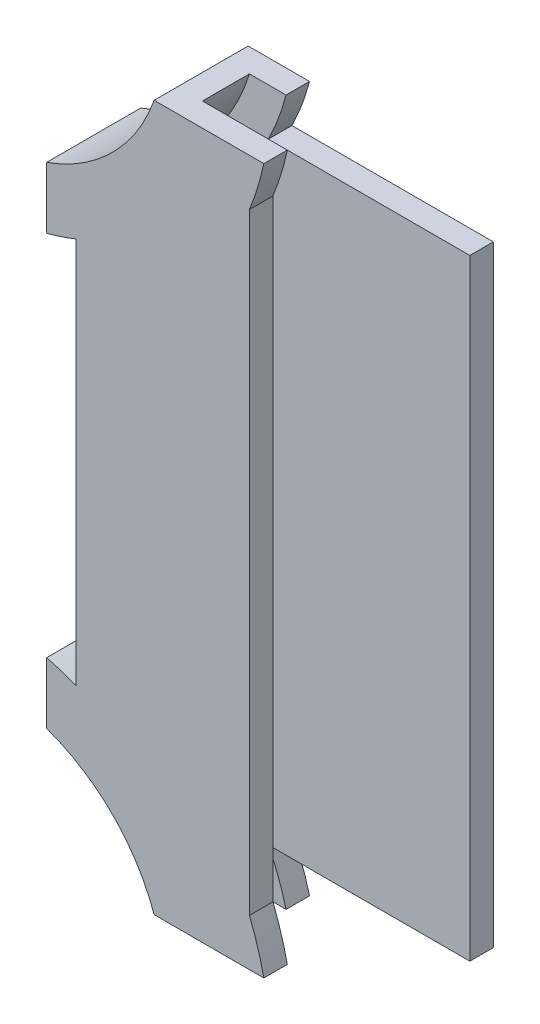
ISO-10303-21;
HEADER;
FILE_DESCRIPTION(('STEP AP214'),'2;1');
FILE_NAME('part.step','',(''),(''),'','','');
FILE_SCHEMA(('AUTOMOTIVE_DESIGN { 1 0 10303 214 1 1 1 1 }'));
ENDSEC;
DATA;
#1=APPLICATION_CONTEXT('core data for automotive mechanical design processes');
#2=APPLICATION_PROTOCOL_DEFINITION('international standard','automotive_design',2000,#1);
#3=PRODUCT_CONTEXT('',#1,'mechanical');
#4=PRODUCT('Part','Part','',(#3));
#5=PRODUCT_RELATED_PRODUCT_CATEGORY('part','',(#4));
#6=PRODUCT_DEFINITION_FORMATION('','',#4);
#7=PRODUCT_DEFINITION_CONTEXT('part definition',#1,'design');
#8=PRODUCT_DEFINITION('design','',#6,#7);
#9=PRODUCT_DEFINITION_SHAPE('','',#8);
#10=(LENGTH_UNIT() NAMED_UNIT(*) SI_UNIT(.MILLI.,.METRE.));
#11=(NAMED_UNIT(*) PLANE_ANGLE_UNIT() SI_UNIT($,.RADIAN.));
#12=(NAMED_UNIT(*) SI_UNIT($,.STERADIAN.) SOLID_ANGLE_UNIT());
#13=UNCERTAINTY_MEASURE_WITH_UNIT(LENGTH_MEASURE(1.E-05),#10,'distance_accuracy_value','');
#14=(GEOMETRIC_REPRESENTATION_CONTEXT(3) GLOBAL_UNCERTAINTY_ASSIGNED_CONTEXT((#13)) GLOBAL_UNIT_ASSIGNED_CONTEXT((#10,
#11,#12)) REPRESENTATION_CONTEXT('',''));
#15=CARTESIAN_POINT('',(0.,0.,0.));
#16=DIRECTION('',(0.,0.,1.));
#17=DIRECTION('',(1.,0.,0.));
#18=AXIS2_PLACEMENT_3D('',#15,#16,#17);
#19=CARTESIAN_POINT('',(-0.327514045387,-0.26,0.06));
#20=DIRECTION('',(-1.,0.,0.));
#21=DIRECTION('',(0.,0.,1.));
#22=AXIS2_PLACEMENT_3D('',#19,#20,#21);
#23=PLANE('',#22);
#24=DIRECTION('',(0.,1.,0.));
#25=VECTOR('',#24,1.);
#26=CARTESIAN_POINT('',(-0.327514045387,0.3,0.08));
#27=LINE('',#26,#25);
#28=CARTESIAN_POINT('',(-0.327514045387056,-0.260000000000183,0.08));
#29=VERTEX_POINT('',#28);
#30=CARTESIAN_POINT('',(-0.327514045387056,0.260000000000183,0.08));
#31=VERTEX_POINT('',#30);
#32=EDGE_CURVE('E188',#29,#31,#27,.T.);
#33=ORIENTED_EDGE('',*,*,#32,.F.);
#34=DIRECTION('',(0.,0.,-1.));
#35=VECTOR('',#34,1.);
#36=CARTESIAN_POINT('',(-0.327514045387112,-0.260000000000045,0.06));
#37=LINE('',#36,#35);
#38=CARTESIAN_POINT('',(-0.327514045387056,-0.260000000000183,0.06));
#39=VERTEX_POINT('',#38);
#40=EDGE_CURVE('E249',#39,#29,#37,.F.);
#41=ORIENTED_EDGE('',*,*,#40,.F.);
#42=DIRECTION('',(0.,1.,0.));
#43=VECTOR('',#42,1.);
#44=CARTESIAN_POINT('',(-0.327514045387,-0.3,0.06));
#45=LINE('',#44,#43);
#46=CARTESIAN_POINT('',(-0.327514045387056,0.260000000000183,0.06));
#47=VERTEX_POINT('',#46);
#48=EDGE_CURVE('E201',#47,#39,#45,.F.);
#49=ORIENTED_EDGE('',*,*,#48,.F.);
#50=DIRECTION('',(0.,0.,-1.));
#51=VECTOR('',#50,1.);
#52=CARTESIAN_POINT('',(-0.327514045387112,0.260000000000045,0.06));
#53=LINE('',#52,#51);
#54=EDGE_CURVE('E200',#31,#47,#53,.T.);
#55=ORIENTED_EDGE('',*,*,#54,.F.);
#56=EDGE_LOOP('',(#33,#41,#49,#55));
#57=FACE_BOUND('',#56,.T.);
#58=ADVANCED_FACE('F17',(#57),#23,.F.);
#59=CARTESIAN_POINT('',(-0.55,0.35,0.06));
#60=DIRECTION('',(0.,0.,-1.));
#61=DIRECTION('',(0.,1.,0.));
#62=AXIS2_PLACEMENT_3D('',#59,#60,#61);
#63=CYLINDRICAL_SURFACE('',#62,0.24);
#64=DIRECTION('',(0.,0.,1.));
#65=VECTOR('',#64,1.);
#66=CARTESIAN_POINT('',(-0.315266108114,0.3,0.));
#67=LINE('',#66,#65);
#68=CARTESIAN_POINT('',(-0.315266108113945,0.3,0.08));
#69=VERTEX_POINT('',#68);
#70=CARTESIAN_POINT('',(-0.315266108113945,0.3,0.06));
#71=VERTEX_POINT('',#70);
#72=EDGE_CURVE('E208',#69,#71,#67,.F.);
#73=ORIENTED_EDGE('',*,*,#72,.F.);
#74=CARTESIAN_POINT('',(-0.55,0.35,0.08));
#75=DIRECTION('',(0.,0.,-1.));
#76=DIRECTION('',(0.,1.,0.));
#77=AXIS2_PLACEMENT_3D('',#74,#75,#76);
#78=CIRCLE('',#77,0.24);
#79=EDGE_CURVE('E20',#31,#69,#78,.F.);
#80=ORIENTED_EDGE('',*,*,#79,.F.);
#81=ORIENTED_EDGE('',*,*,#54,.T.);
#82=CARTESIAN_POINT('',(-0.55,0.35,0.06));
#83=DIRECTION('',(0.,0.,-1.));
#84=DIRECTION('',(0.,1.,0.));
#85=AXIS2_PLACEMENT_3D('',#82,#83,#84);
#86=CIRCLE('',#85,0.24);
#87=EDGE_CURVE('E317',#71,#47,#86,.T.);
#88=ORIENTED_EDGE('',*,*,#87,.F.);
#89=EDGE_LOOP('',(#73,#80,#81,#88));
#90=FACE_BOUND('',#89,.T.);
#91=ADVANCED_FACE('F207',(#90),#63,.T.);
#92=CARTESIAN_POINT('',(-0.55,0.35,0.02));
#93=DIRECTION('',(0.,0.,-1.));
#94=DIRECTION('',(-1.,0.,0.));
#95=AXIS2_PLACEMENT_3D('',#92,#93,#94);
#96=CYLINDRICAL_SURFACE('',#95,0.17);
#97=DIRECTION('',(0.,0.,1.));
#98=VECTOR('',#97,1.);
#99=CARTESIAN_POINT('',(-0.387519231907,0.3,0.));
#100=LINE('',#99,#98);
#101=CARTESIAN_POINT('',(-0.38751923190714,0.3,0.06));
#102=VERTEX_POINT('',#101);
#103=CARTESIAN_POINT('',(-0.38751923190714,0.3,0.02));
#104=VERTEX_POINT('',#103);
#105=EDGE_CURVE('E241',#102,#104,#100,.F.);
#106=ORIENTED_EDGE('',*,*,#105,.F.);
#107=CARTESIAN_POINT('',(-0.55,0.35,0.06));
#108=DIRECTION('',(0.,0.,-1.));
#109=DIRECTION('',(-1.,0.,0.));
#110=AXIS2_PLACEMENT_3D('',#107,#108,#109);
#111=CIRCLE('',#110,0.17);
#112=CARTESIAN_POINT('',(-0.495,0.189142920578773,0.06));
#113=VERTEX_POINT('',#112);
#114=EDGE_CURVE('E319',#113,#102,#111,.F.);
#115=ORIENTED_EDGE('',*,*,#114,.F.);
#116=DIRECTION('',(0.,0.,-1.));
#117=VECTOR('',#116,1.);
#118=CARTESIAN_POINT('',(-0.495,0.189142920579,0.02));
#119=LINE('',#118,#117);
#120=CARTESIAN_POINT('',(-0.495,0.189142920578773,0.02));
#121=VERTEX_POINT('',#120);
#122=EDGE_CURVE('E197',#121,#113,#119,.F.);
#123=ORIENTED_EDGE('',*,*,#122,.F.);
#124=CARTESIAN_POINT('',(-0.55,0.35,0.02));
#125=DIRECTION('',(0.,0.,-1.));
#126=DIRECTION('',(-1.,0.,0.));
#127=AXIS2_PLACEMENT_3D('',#124,#125,#126);
#128=CIRCLE('',#127,0.17);
#129=EDGE_CURVE('E307',#121,#104,#128,.F.);
#130=ORIENTED_EDGE('',*,*,#129,.T.);
#131=EDGE_LOOP('',(#106,#115,#123,#130));
#132=FACE_BOUND('',#131,.T.);
#133=ADVANCED_FACE('F679',(#132),#96,.T.);
#134=CARTESIAN_POINT('',(-0.495,0.3,0.02));
#135=DIRECTION('',(1.,0.,0.));
#136=DIRECTION('',(0.,0.,-1.));
#137=AXIS2_PLACEMENT_3D('',#134,#135,#136);
#138=PLANE('',#137);
#139=DIRECTION('',(0.,1.,0.));
#140=VECTOR('',#139,1.);
#141=CARTESIAN_POINT('',(-0.495,-0.3,0.02));
#142=LINE('',#141,#140);
#143=CARTESIAN_POINT('',(-0.494999999999961,0.157711154769717,0.02));
#144=VERTEX_POINT('',#143);
#145=EDGE_CURVE('E309',#144,#121,#142,.T.);
#146=ORIENTED_EDGE('',*,*,#145,.T.);
#147=ORIENTED_EDGE('',*,*,#122,.T.);
#148=DIRECTION('',(0.,1.,0.));
#149=VECTOR('',#148,1.);
#150=CARTESIAN_POINT('',(-0.495,-0.3,0.06));
#151=LINE('',#150,#149);
#152=CARTESIAN_POINT('',(-0.494999999999961,0.157711154769717,0.06));
#153=VERTEX_POINT('',#152);
#154=EDGE_CURVE('E320',#153,#113,#151,.T.);
#155=ORIENTED_EDGE('',*,*,#154,.F.);
#156=DIRECTION('',(0.,0.,-1.));
#157=VECTOR('',#156,1.);
#158=CARTESIAN_POINT('',(-0.494999999999922,0.157711154769728,0.));
#159=LINE('',#158,#157);
#160=EDGE_CURVE('E224',#144,#153,#159,.F.);
#161=ORIENTED_EDGE('',*,*,#160,.F.);
#162=EDGE_LOOP('',(#146,#147,#155,#161));
#163=FACE_BOUND('',#162,.T.);
#164=ADVANCED_FACE('F671',(#163),#138,.T.);
#165=CARTESIAN_POINT('',(-0.475,-0.164595037823,0.));
#166=DIRECTION('',(-1.,0.,0.));
#167=DIRECTION('',(0.,-1.,0.));
#168=AXIS2_PLACEMENT_3D('',#165,#166,#167);
#169=PLANE('',#168);
#170=DIRECTION('',(0.,1.,0.));
#171=VECTOR('',#170,1.);
#172=CARTESIAN_POINT('',(-0.475,-0.3,0.06));
#173=LINE('',#172,#171);
#174=CARTESIAN_POINT('',(-0.474999999999932,-0.164595037822636,0.06));
#175=VERTEX_POINT('',#174);
#176=CARTESIAN_POINT('',(-0.474999999999932,0.164595037822636,0.06));
#177=VERTEX_POINT('',#176);
#178=EDGE_CURVE('E218',#175,#177,#173,.T.);
#179=ORIENTED_EDGE('',*,*,#178,.F.);
#180=DIRECTION('',(0.,0.,-1.));
#181=VECTOR('',#180,1.);
#182=CARTESIAN_POINT('',(-0.474999999999864,-0.164595037822663,0.));
#183=LINE('',#182,#181);
#184=CARTESIAN_POINT('',(-0.474999999999932,-0.164595037822636,0.08));
#185=VERTEX_POINT('',#184);
#186=EDGE_CURVE('E291',#185,#175,#183,.T.);
#187=ORIENTED_EDGE('',*,*,#186,.F.);
#188=DIRECTION('',(0.,1.,0.));
#189=VECTOR('',#188,1.);
#190=CARTESIAN_POINT('',(-0.475,0.3,0.08));
#191=LINE('',#190,#189);
#192=CARTESIAN_POINT('',(-0.474999999999932,0.164595037822636,0.08));
#193=VERTEX_POINT('',#192);
#194=EDGE_CURVE('E209',#193,#185,#191,.F.);
#195=ORIENTED_EDGE('',*,*,#194,.F.);
#196=DIRECTION('',(0.,0.,-1.));
#197=VECTOR('',#196,1.);
#198=CARTESIAN_POINT('',(-0.474999999999864,0.164595037822663,0.));
#199=LINE('',#198,#197);
#200=EDGE_CURVE('E223',#177,#193,#199,.F.);
#201=ORIENTED_EDGE('',*,*,#200,.F.);
#202=EDGE_LOOP('',(#179,#187,#195,#201));
#203=FACE_BOUND('',#202,.T.);
#204=ADVANCED_FACE('F407',(#203),#169,.T.);
#205=CARTESIAN_POINT('',(-0.495,0.3,0.02));
#206=DIRECTION('',(1.,0.,0.));
#207=DIRECTION('',(0.,0.,-1.));
#208=AXIS2_PLACEMENT_3D('',#205,#206,#207);
#209=PLANE('',#208);
#210=DIRECTION('',(0.,1.,0.));
#211=VECTOR('',#210,1.);
#212=CARTESIAN_POINT('',(-0.495,-0.3,0.02));
#213=LINE('',#212,#211);
#214=CARTESIAN_POINT('',(-0.49499999999993,-0.18914292057857,0.02));
#215=VERTEX_POINT('',#214);
#216=CARTESIAN_POINT('',(-0.494999999999961,-0.157711154769717,0.02));
#217=VERTEX_POINT('',#216);
#218=EDGE_CURVE('E313',#215,#217,#213,.T.);
#219=ORIENTED_EDGE('',*,*,#218,.T.);
#220=DIRECTION('',(0.,0.,-1.));
#221=VECTOR('',#220,1.);
#222=CARTESIAN_POINT('',(-0.494999999999922,-0.157711154769728,0.));
#223=LINE('',#222,#221);
#224=CARTESIAN_POINT('',(-0.494999999999961,-0.157711154769717,0.06));
#225=VERTEX_POINT('',#224);
#226=EDGE_CURVE('E290',#225,#217,#223,.T.);
#227=ORIENTED_EDGE('',*,*,#226,.F.);
#228=DIRECTION('',(0.,1.,0.));
#229=VECTOR('',#228,1.);
#230=CARTESIAN_POINT('',(-0.495,-0.3,0.06));
#231=LINE('',#230,#229);
#232=CARTESIAN_POINT('',(-0.49499999999993,-0.18914292057857,0.06));
#233=VERTEX_POINT('',#232);
#234=EDGE_CURVE('E323',#233,#225,#231,.T.);
#235=ORIENTED_EDGE('',*,*,#234,.F.);
#236=DIRECTION('',(0.,0.,-1.));
#237=VECTOR('',#236,1.);
#238=CARTESIAN_POINT('',(-0.494999999999861,-0.189142920578593,0.02));
#239=LINE('',#238,#237);
#240=EDGE_CURVE('E210',#215,#233,#239,.F.);
#241=ORIENTED_EDGE('',*,*,#240,.F.);
#242=EDGE_LOOP('',(#219,#227,#235,#241));
#243=FACE_BOUND('',#242,.T.);
#244=ADVANCED_FACE('F656',(#243),#209,.T.);
#245=CARTESIAN_POINT('',(-0.5,0.3,0.08));
#246=DIRECTION('',(0.,0.,1.));
#247=DIRECTION('',(1.,0.,0.));
#248=AXIS2_PLACEMENT_3D('',#245,#246,#247);
#249=PLANE('',#248);
#250=DIRECTION('',(1.,0.,0.));
#251=VECTOR('',#250,1.);
#252=CARTESIAN_POINT('',(-0.2,-0.3,0.08));
#253=LINE('',#252,#251);
#254=CARTESIAN_POINT('',(-0.315266108113945,-0.3,0.08));
#255=VERTEX_POINT('',#254);
#256=CARTESIAN_POINT('',(-0.408578643762845,-0.3,0.08));
#257=VERTEX_POINT('',#256);
#258=EDGE_CURVE('E285',#255,#257,#253,.F.);
#259=ORIENTED_EDGE('',*,*,#258,.F.);
#260=CARTESIAN_POINT('',(-0.55,-0.35,0.08));
#261=DIRECTION('',(0.,0.,-1.));
#262=DIRECTION('',(0.,1.,0.));
#263=AXIS2_PLACEMENT_3D('',#260,#261,#262);
#264=CIRCLE('',#263,0.24);
#265=EDGE_CURVE('E194',#29,#255,#264,.T.);
#266=ORIENTED_EDGE('',*,*,#265,.F.);
#267=ORIENTED_EDGE('',*,*,#32,.T.);
#268=ORIENTED_EDGE('',*,*,#79,.T.);
#269=DIRECTION('',(1.,0.,0.));
#270=VECTOR('',#269,1.);
#271=CARTESIAN_POINT('',(-0.5,0.3,0.08));
#272=LINE('',#271,#270);
#273=CARTESIAN_POINT('',(-0.408578643762708,0.299999999999951,0.08));
#274=VERTEX_POINT('',#273);
#275=EDGE_CURVE('E234',#274,#69,#272,.T.);
#276=ORIENTED_EDGE('',*,*,#275,.F.);
#277=CARTESIAN_POINT('',(-0.55,0.35,0.08));
#278=DIRECTION('',(0.,0.,-1.));
#279=DIRECTION('',(-1.,0.,0.));
#280=AXIS2_PLACEMENT_3D('',#277,#278,#279);
#281=CIRCLE('',#280,0.15);
#282=CARTESIAN_POINT('',(-0.5,0.208578643762845,0.08));
#283=VERTEX_POINT('',#282);
#284=EDGE_CURVE('E233',#274,#283,#281,.T.);
#285=ORIENTED_EDGE('',*,*,#284,.T.);
#286=DIRECTION('',(0.,1.,0.));
#287=VECTOR('',#286,1.);
#288=CARTESIAN_POINT('',(-0.5,-0.3,0.08));
#289=LINE('',#288,#287);
#290=CARTESIAN_POINT('',(-0.499999999999955,0.156350832689641,0.08));
#291=VERTEX_POINT('',#290);
#292=EDGE_CURVE('E230',#291,#283,#289,.T.);
#293=ORIENTED_EDGE('',*,*,#292,.F.);
#294=CARTESIAN_POINT('',(-0.55,0.35,0.08));
#295=DIRECTION('',(0.,0.,-1.));
#296=DIRECTION('',(0.,1.,0.));
#297=AXIS2_PLACEMENT_3D('',#294,#295,#296);
#298=CIRCLE('',#297,0.2);
#299=EDGE_CURVE('E302',#193,#291,#298,.T.);
#300=ORIENTED_EDGE('',*,*,#299,.F.);
#301=ORIENTED_EDGE('',*,*,#194,.T.);
#302=CARTESIAN_POINT('',(-0.55,-0.35,0.08));
#303=DIRECTION('',(0.,0.,-1.));
#304=DIRECTION('',(0.,1.,0.));
#305=AXIS2_PLACEMENT_3D('',#302,#303,#304);
#306=CIRCLE('',#305,0.2);
#307=CARTESIAN_POINT('',(-0.5,-0.156350832689815,0.08));
#308=VERTEX_POINT('',#307);
#309=EDGE_CURVE('E292',#308,#185,#306,.T.);
#310=ORIENTED_EDGE('',*,*,#309,.F.);
#311=DIRECTION('',(0.,1.,0.));
#312=VECTOR('',#311,1.);
#313=CARTESIAN_POINT('',(-0.5,-0.3,0.08));
#314=LINE('',#313,#312);
#315=CARTESIAN_POINT('',(-0.499999999999951,-0.208578643762708,0.08));
#316=VERTEX_POINT('',#315);
#317=EDGE_CURVE('E343',#316,#308,#314,.T.);
#318=ORIENTED_EDGE('',*,*,#317,.F.);
#319=CARTESIAN_POINT('',(-0.55,-0.35,0.08));
#320=DIRECTION('',(0.,0.,-1.));
#321=DIRECTION('',(-1.,0.,0.));
#322=AXIS2_PLACEMENT_3D('',#319,#320,#321);
#323=CIRCLE('',#322,0.15);
#324=EDGE_CURVE('E282',#316,#257,#323,.T.);
#325=ORIENTED_EDGE('',*,*,#324,.T.);
#326=EDGE_LOOP('',(#259,#266,#267,#268,#276,#285,#293,#300,#301,#310,#318,#325));
#327=FACE_BOUND('',#326,.T.);
#328=ADVANCED_FACE('F191',(#327),#249,.T.);
#329=CARTESIAN_POINT('',(-0.55,-0.35,0.02));
#330=DIRECTION('',(0.,0.,-1.));
#331=DIRECTION('',(-1.,0.,0.));
#332=AXIS2_PLACEMENT_3D('',#329,#330,#331);
#333=CYLINDRICAL_SURFACE('',#332,0.17);
#334=ORIENTED_EDGE('',*,*,#240,.T.);
#335=CARTESIAN_POINT('',(-0.55,-0.35,0.06));
#336=DIRECTION('',(0.,0.,-1.));
#337=DIRECTION('',(-1.,0.,0.));
#338=AXIS2_PLACEMENT_3D('',#335,#336,#337);
#339=CIRCLE('',#338,0.17);
#340=CARTESIAN_POINT('',(-0.38751923190714,-0.3,0.06));
#341=VERTEX_POINT('',#340);
#342=EDGE_CURVE('E321',#341,#233,#339,.F.);
#343=ORIENTED_EDGE('',*,*,#342,.F.);
#344=DIRECTION('',(0.,0.,-1.));
#345=VECTOR('',#344,1.);
#346=CARTESIAN_POINT('',(-0.387519231907,-0.3,0.));
#347=LINE('',#346,#345);
#348=CARTESIAN_POINT('',(-0.38751923190714,-0.3,0.02));
#349=VERTEX_POINT('',#348);
#350=EDGE_CURVE('E333',#349,#341,#347,.F.);
#351=ORIENTED_EDGE('',*,*,#350,.F.);
#352=CARTESIAN_POINT('',(-0.55,-0.35,0.02));
#353=DIRECTION('',(0.,0.,-1.));
#354=DIRECTION('',(-1.,0.,0.));
#355=AXIS2_PLACEMENT_3D('',#352,#353,#354);
#356=CIRCLE('',#355,0.17);
#357=EDGE_CURVE('E310',#349,#215,#356,.F.);
#358=ORIENTED_EDGE('',*,*,#357,.T.);
#359=EDGE_LOOP('',(#334,#343,#351,#358));
#360=FACE_BOUND('',#359,.T.);
#361=ADVANCED_FACE('F488',(#360),#333,.T.);
#362=CARTESIAN_POINT('',(-0.495,-0.3,0.06));
#363=DIRECTION('',(0.,0.,-1.));
#364=DIRECTION('',(0.,1.,0.));
#365=AXIS2_PLACEMENT_3D('',#362,#363,#364);
#366=PLANE('',#365);
#367=DIRECTION('',(1.,0.,0.));
#368=VECTOR('',#367,1.);
#369=CARTESIAN_POINT('',(-0.5,0.3,0.06));
#370=LINE('',#369,#368);
#371=EDGE_CURVE('E238',#71,#102,#370,.F.);
#372=ORIENTED_EDGE('',*,*,#371,.F.);
#373=ORIENTED_EDGE('',*,*,#87,.T.);
#374=ORIENTED_EDGE('',*,*,#48,.T.);
#375=CARTESIAN_POINT('',(-0.55,-0.35,0.06));
#376=DIRECTION('',(0.,0.,-1.));
#377=DIRECTION('',(0.,1.,0.));
#378=AXIS2_PLACEMENT_3D('',#375,#376,#377);
#379=CIRCLE('',#378,0.24);
#380=CARTESIAN_POINT('',(-0.315266108113945,-0.3,0.06));
#381=VERTEX_POINT('',#380);
#382=EDGE_CURVE('E250',#381,#39,#379,.F.);
#383=ORIENTED_EDGE('',*,*,#382,.F.);
#384=DIRECTION('',(1.,0.,0.));
#385=VECTOR('',#384,1.);
#386=CARTESIAN_POINT('',(-0.2,-0.3,0.06));
#387=LINE('',#386,#385);
#388=EDGE_CURVE('E335',#341,#381,#387,.T.);
#389=ORIENTED_EDGE('',*,*,#388,.F.);
#390=ORIENTED_EDGE('',*,*,#342,.T.);
#391=ORIENTED_EDGE('',*,*,#234,.T.);
#392=CARTESIAN_POINT('',(-0.55,-0.35,0.06));
#393=DIRECTION('',(0.,0.,-1.));
#394=DIRECTION('',(0.,1.,0.));
#395=AXIS2_PLACEMENT_3D('',#392,#393,#394);
#396=CIRCLE('',#395,0.2);
#397=EDGE_CURVE('E287',#175,#225,#396,.F.);
#398=ORIENTED_EDGE('',*,*,#397,.F.);
#399=ORIENTED_EDGE('',*,*,#178,.T.);
#400=CARTESIAN_POINT('',(-0.55,0.35,0.06));
#401=DIRECTION('',(0.,0.,-1.));
#402=DIRECTION('',(0.,1.,0.));
#403=AXIS2_PLACEMENT_3D('',#400,#401,#402);
#404=CIRCLE('',#403,0.2);
#405=EDGE_CURVE('E226',#153,#177,#404,.F.);
#406=ORIENTED_EDGE('',*,*,#405,.F.);
#407=ORIENTED_EDGE('',*,*,#154,.T.);
#408=ORIENTED_EDGE('',*,*,#114,.T.);
#409=EDGE_LOOP('',(#372,#373,#374,#383,#389,#390,#391,#398,#399,#406,#407,#408));
#410=FACE_BOUND('',#409,.T.);
#411=ADVANCED_FACE('F400',(#410),#366,.T.);
#412=CARTESIAN_POINT('',(-0.55,-0.35,0.06));
#413=DIRECTION('',(0.,0.,-1.));
#414=DIRECTION('',(0.,1.,0.));
#415=AXIS2_PLACEMENT_3D('',#412,#413,#414);
#416=CYLINDRICAL_SURFACE('',#415,0.24);
#417=ORIENTED_EDGE('',*,*,#40,.T.);
#418=ORIENTED_EDGE('',*,*,#265,.T.);
#419=DIRECTION('',(0.,0.,-1.));
#420=VECTOR('',#419,1.);
#421=CARTESIAN_POINT('',(-0.315266108114,-0.3,0.));
#422=LINE('',#421,#420);
#423=EDGE_CURVE('E338',#381,#255,#422,.F.);
#424=ORIENTED_EDGE('',*,*,#423,.F.);
#425=ORIENTED_EDGE('',*,*,#382,.T.);
#426=EDGE_LOOP('',(#417,#418,#424,#425));
#427=FACE_BOUND('',#426,.T.);
#428=ADVANCED_FACE('F491',(#427),#416,.T.);
#429=CARTESIAN_POINT('',(-0.495,-0.3,0.02));
#430=DIRECTION('',(0.,0.,-1.));
#431=DIRECTION('',(0.,1.,0.));
#432=AXIS2_PLACEMENT_3D('',#429,#430,#431);
#433=PLANE('',#432);
#434=DIRECTION('',(0.,1.,0.));
#435=VECTOR('',#434,1.);
#436=CARTESIAN_POINT('',(-0.2,0.3,0.02));
#437=LINE('',#436,#435);
#438=CARTESIAN_POINT('',(-0.2,0.26,0.02));
#439=VERTEX_POINT('',#438);
#440=CARTESIAN_POINT('',(-0.2,-0.26,0.02));
#441=VERTEX_POINT('',#440);
#442=EDGE_CURVE('E383',#439,#441,#437,.F.);
#443=ORIENTED_EDGE('',*,*,#442,.F.);
#444=DIRECTION('',(1.,0.,0.));
#445=VECTOR('',#444,1.);
#446=CARTESIAN_POINT('',(-0.371394289005,0.26,0.02));
#447=LINE('',#446,#445);
#448=CARTESIAN_POINT('',(-0.371394289005041,0.26,0.02));
#449=VERTEX_POINT('',#448);
#450=EDGE_CURVE('E276',#449,#439,#447,.T.);
#451=ORIENTED_EDGE('',*,*,#450,.F.);
#452=CARTESIAN_POINT('',(-0.55,0.35,0.02));
#453=DIRECTION('',(0.,0.,-1.));
#454=DIRECTION('',(0.,1.,0.));
#455=AXIS2_PLACEMENT_3D('',#452,#453,#454);
#456=CIRCLE('',#455,0.2);
#457=CARTESIAN_POINT('',(-0.356350832689815,0.3,0.02));
#458=VERTEX_POINT('',#457);
#459=EDGE_CURVE('E247',#458,#449,#456,.T.);
#460=ORIENTED_EDGE('',*,*,#459,.F.);
#461=DIRECTION('',(1.,0.,0.));
#462=VECTOR('',#461,1.);
#463=CARTESIAN_POINT('',(-0.5,0.3,0.02));
#464=LINE('',#463,#462);
#465=EDGE_CURVE('E245',#104,#458,#464,.T.);
#466=ORIENTED_EDGE('',*,*,#465,.F.);
#467=ORIENTED_EDGE('',*,*,#129,.F.);
#468=ORIENTED_EDGE('',*,*,#145,.F.);
#469=CARTESIAN_POINT('',(-0.55,0.35,0.02));
#470=DIRECTION('',(0.,0.,-1.));
#471=DIRECTION('',(0.,1.,0.));
#472=AXIS2_PLACEMENT_3D('',#469,#470,#471);
#473=CIRCLE('',#472,0.2);
#474=CARTESIAN_POINT('',(-0.475000000000003,0.164595037822804,0.02));
#475=VERTEX_POINT('',#474);
#476=EDGE_CURVE('E227',#475,#144,#473,.T.);
#477=ORIENTED_EDGE('',*,*,#476,.F.);
#478=DIRECTION('',(0.,-1.,0.));
#479=VECTOR('',#478,1.);
#480=CARTESIAN_POINT('',(-0.475,-0.164595037823,0.02));
#481=LINE('',#480,#479);
#482=CARTESIAN_POINT('',(-0.474999999999932,-0.164595037822636,0.02));
#483=VERTEX_POINT('',#482);
#484=EDGE_CURVE('E220',#483,#475,#481,.F.);
#485=ORIENTED_EDGE('',*,*,#484,.F.);
#486=CARTESIAN_POINT('',(-0.55,-0.35,0.02));
#487=DIRECTION('',(0.,0.,-1.));
#488=DIRECTION('',(0.,1.,0.));
#489=AXIS2_PLACEMENT_3D('',#486,#487,#488);
#490=CIRCLE('',#489,0.2);
#491=EDGE_CURVE('E295',#217,#483,#490,.T.);
#492=ORIENTED_EDGE('',*,*,#491,.F.);
#493=ORIENTED_EDGE('',*,*,#218,.F.);
#494=ORIENTED_EDGE('',*,*,#357,.F.);
#495=DIRECTION('',(1.,0.,0.));
#496=VECTOR('',#495,1.);
#497=CARTESIAN_POINT('',(-0.2,-0.3,0.02));
#498=LINE('',#497,#496);
#499=CARTESIAN_POINT('',(-0.356350832689641,-0.299999999999955,0.02));
#500=VERTEX_POINT('',#499);
#501=EDGE_CURVE('E336',#500,#349,#498,.F.);
#502=ORIENTED_EDGE('',*,*,#501,.F.);
#503=CARTESIAN_POINT('',(-0.55,-0.35,0.02));
#504=DIRECTION('',(0.,0.,-1.));
#505=DIRECTION('',(0.,1.,0.));
#506=AXIS2_PLACEMENT_3D('',#503,#504,#505);
#507=CIRCLE('',#506,0.2);
#508=CARTESIAN_POINT('',(-0.371394289005041,-0.26,0.02));
#509=VERTEX_POINT('',#508);
#510=EDGE_CURVE('E277',#509,#500,#507,.T.);
#511=ORIENTED_EDGE('',*,*,#510,.F.);
#512=DIRECTION('',(1.,0.,0.));
#513=VECTOR('',#512,1.);
#514=CARTESIAN_POINT('',(-0.2,-0.26,0.02));
#515=LINE('',#514,#513);
#516=EDGE_CURVE('E386',#441,#509,#515,.F.);
#517=ORIENTED_EDGE('',*,*,#516,.F.);
#518=EDGE_LOOP('',(#443,#451,#460,#466,#467,#468,#477,#485,#492,#493,#494,#502,#511,#517));
#519=FACE_BOUND('',#518,.T.);
#520=ADVANCED_FACE('F356',(#519),#433,.F.);
#521=CARTESIAN_POINT('',(-0.55,0.35,0.));
#522=DIRECTION('',(0.,0.,-1.));
#523=DIRECTION('',(0.,1.,0.));
#524=AXIS2_PLACEMENT_3D('',#521,#522,#523);
#525=CYLINDRICAL_SURFACE('',#524,0.2);
#526=DIRECTION('',(0.,0.,1.));
#527=VECTOR('',#526,1.);
#528=CARTESIAN_POINT('',(-0.35635083269,0.3,0.));
#529=LINE('',#528,#527);
#530=CARTESIAN_POINT('',(-0.356350832689815,0.3,0.));
#531=VERTEX_POINT('',#530);
#532=EDGE_CURVE('E236',#458,#531,#529,.F.);
#533=ORIENTED_EDGE('',*,*,#532,.F.);
#534=ORIENTED_EDGE('',*,*,#459,.T.);
#535=DIRECTION('',(0.,0.,1.));
#536=VECTOR('',#535,1.);
#537=CARTESIAN_POINT('',(-0.371394289005,0.26,0.));
#538=LINE('',#537,#536);
#539=CARTESIAN_POINT('',(-0.371394289005041,0.26,0.));
#540=VERTEX_POINT('',#539);
#541=EDGE_CURVE('E380',#540,#449,#538,.T.);
#542=ORIENTED_EDGE('',*,*,#541,.F.);
#543=CARTESIAN_POINT('',(-0.55,0.35,0.));
#544=DIRECTION('',(0.,0.,-1.));
#545=DIRECTION('',(0.,1.,0.));
#546=AXIS2_PLACEMENT_3D('',#543,#544,#545);
#547=CIRCLE('',#546,0.2);
#548=EDGE_CURVE('E273',#540,#531,#547,.F.);
#549=ORIENTED_EDGE('',*,*,#548,.T.);
#550=EDGE_LOOP('',(#533,#534,#542,#549));
#551=FACE_BOUND('',#550,.T.);
#552=ADVANCED_FACE('F480',(#551),#525,.T.);
#553=CARTESIAN_POINT('',(-0.5,0.3,0.));
#554=DIRECTION('',(0.,1.,0.));
#555=DIRECTION('',(0.,0.,1.));
#556=AXIS2_PLACEMENT_3D('',#553,#554,#555);
#557=PLANE('',#556);
#558=ORIENTED_EDGE('',*,*,#371,.T.);
#559=ORIENTED_EDGE('',*,*,#105,.T.);
#560=ORIENTED_EDGE('',*,*,#465,.T.);
#561=ORIENTED_EDGE('',*,*,#532,.T.);
#562=DIRECTION('',(1.,0.,0.));
#563=VECTOR('',#562,1.);
#564=CARTESIAN_POINT('',(-0.5,0.3,0.));
#565=LINE('',#564,#563);
#566=CARTESIAN_POINT('',(-0.408578643762708,0.299999999999951,0.));
#567=VERTEX_POINT('',#566);
#568=EDGE_CURVE('E272',#531,#567,#565,.F.);
#569=ORIENTED_EDGE('',*,*,#568,.T.);
#570=DIRECTION('',(0.,0.,-1.));
#571=VECTOR('',#570,1.);
#572=CARTESIAN_POINT('',(-0.408578643762725,0.299999999999903,0.));
#573=LINE('',#572,#571);
#574=EDGE_CURVE('E244',#567,#274,#573,.F.);
#575=ORIENTED_EDGE('',*,*,#574,.T.);
#576=ORIENTED_EDGE('',*,*,#275,.T.);
#577=ORIENTED_EDGE('',*,*,#72,.T.);
#578=EDGE_LOOP('',(#558,#559,#560,#561,#569,#575,#576,#577));
#579=FACE_BOUND('',#578,.T.);
#580=ADVANCED_FACE('F476',(#579),#557,.T.);
#581=CARTESIAN_POINT('',(-0.55,0.35,0.));
#582=DIRECTION('',(0.,0.,-1.));
#583=DIRECTION('',(-1.,0.,0.));
#584=AXIS2_PLACEMENT_3D('',#581,#582,#583);
#585=CYLINDRICAL_SURFACE('',#584,0.15);
#586=ORIENTED_EDGE('',*,*,#284,.F.);
#587=ORIENTED_EDGE('',*,*,#574,.F.);
#588=CARTESIAN_POINT('',(-0.55,0.35,0.));
#589=DIRECTION('',(0.,0.,-1.));
#590=DIRECTION('',(-1.,0.,0.));
#591=AXIS2_PLACEMENT_3D('',#588,#589,#590);
#592=CIRCLE('',#591,0.15);
#593=CARTESIAN_POINT('',(-0.5,0.208578643762845,0.));
#594=VERTEX_POINT('',#593);
#595=EDGE_CURVE('E269',#567,#594,#592,.T.);
#596=ORIENTED_EDGE('',*,*,#595,.T.);
#597=DIRECTION('',(0.,0.,1.));
#598=VECTOR('',#597,1.);
#599=CARTESIAN_POINT('',(-0.5,0.208578643763,0.));
#600=LINE('',#599,#598);
#601=EDGE_CURVE('E232',#283,#594,#600,.F.);
#602=ORIENTED_EDGE('',*,*,#601,.F.);
#603=EDGE_LOOP('',(#586,#587,#596,#602));
#604=FACE_BOUND('',#603,.T.);
#605=ADVANCED_FACE('F474',(#604),#585,.F.);
#606=CARTESIAN_POINT('',(-0.5,-0.3,0.));
#607=DIRECTION('',(-1.,0.,0.));
#608=DIRECTION('',(0.,0.,1.));
#609=AXIS2_PLACEMENT_3D('',#606,#607,#608);
#610=PLANE('',#609);
#611=DIRECTION('',(0.,1.,0.));
#612=VECTOR('',#611,1.);
#613=CARTESIAN_POINT('',(-0.5,0.3,0.));
#614=LINE('',#613,#612);
#615=CARTESIAN_POINT('',(-0.499999999999955,0.156350832689641,0.));
#616=VERTEX_POINT('',#615);
#617=EDGE_CURVE('E268',#594,#616,#614,.F.);
#618=ORIENTED_EDGE('',*,*,#617,.T.);
#619=DIRECTION('',(0.,0.,-1.));
#620=VECTOR('',#619,1.);
#621=CARTESIAN_POINT('',(-0.49999999999991,0.156350832689652,0.));
#622=LINE('',#621,#620);
#623=EDGE_CURVE('E301',#291,#616,#622,.T.);
#624=ORIENTED_EDGE('',*,*,#623,.F.);
#625=ORIENTED_EDGE('',*,*,#292,.T.);
#626=ORIENTED_EDGE('',*,*,#601,.T.);
#627=EDGE_LOOP('',(#618,#624,#625,#626));
#628=FACE_BOUND('',#627,.T.);
#629=ADVANCED_FACE('F468',(#628),#610,.T.);
#630=CARTESIAN_POINT('',(-0.55,0.35,0.));
#631=DIRECTION('',(0.,0.,-1.));
#632=DIRECTION('',(0.,1.,0.));
#633=AXIS2_PLACEMENT_3D('',#630,#631,#632);
#634=CYLINDRICAL_SURFACE('',#633,0.2);
#635=ORIENTED_EDGE('',*,*,#405,.T.);
#636=ORIENTED_EDGE('',*,*,#200,.T.);
#637=ORIENTED_EDGE('',*,*,#299,.T.);
#638=ORIENTED_EDGE('',*,*,#623,.T.);
#639=CARTESIAN_POINT('',(-0.55,0.35,0.));
#640=DIRECTION('',(0.,0.,-1.));
#641=DIRECTION('',(0.,1.,0.));
#642=AXIS2_PLACEMENT_3D('',#639,#640,#641);
#643=CIRCLE('',#642,0.2);
#644=CARTESIAN_POINT('',(-0.475000000000002,0.164595037822804,0.));
#645=VERTEX_POINT('',#644);
#646=EDGE_CURVE('E265',#616,#645,#643,.F.);
#647=ORIENTED_EDGE('',*,*,#646,.T.);
#648=DIRECTION('',(0.,0.,1.));
#649=VECTOR('',#648,1.);
#650=CARTESIAN_POINT('',(-0.475000000000003,0.164595037823,0.));
#651=LINE('',#650,#649);
#652=EDGE_CURVE('E222',#475,#645,#651,.F.);
#653=ORIENTED_EDGE('',*,*,#652,.F.);
#654=ORIENTED_EDGE('',*,*,#476,.T.);
#655=ORIENTED_EDGE('',*,*,#160,.T.);
#656=EDGE_LOOP('',(#635,#636,#637,#638,#647,#653,#654,#655));
#657=FACE_BOUND('',#656,.T.);
#658=ADVANCED_FACE('F405',(#657),#634,.T.);
#659=CARTESIAN_POINT('',(-0.475,-0.164595037823,0.));
#660=DIRECTION('',(-1.,0.,0.));
#661=DIRECTION('',(0.,-1.,0.));
#662=AXIS2_PLACEMENT_3D('',#659,#660,#661);
#663=PLANE('',#662);
#664=DIRECTION('',(0.,1.,0.));
#665=VECTOR('',#664,1.);
#666=CARTESIAN_POINT('',(-0.475,0.3,0.));
#667=LINE('',#666,#665);
#668=CARTESIAN_POINT('',(-0.474999999999932,-0.164595037822636,0.));
#669=VERTEX_POINT('',#668);
#670=EDGE_CURVE('E264',#645,#669,#667,.F.);
#671=ORIENTED_EDGE('',*,*,#670,.T.);
#672=DIRECTION('',(0.,0.,-1.));
#673=VECTOR('',#672,1.);
#674=CARTESIAN_POINT('',(-0.474999999999864,-0.164595037822663,0.));
#675=LINE('',#674,#673);
#676=EDGE_CURVE('E294',#483,#669,#675,.T.);
#677=ORIENTED_EDGE('',*,*,#676,.F.);
#678=ORIENTED_EDGE('',*,*,#484,.T.);
#679=ORIENTED_EDGE('',*,*,#652,.T.);
#680=EDGE_LOOP('',(#671,#677,#678,#679));
#681=FACE_BOUND('',#680,.T.);
#682=ADVANCED_FACE('F362',(#681),#663,.T.);
#683=CARTESIAN_POINT('',(-0.55,-0.35,0.));
#684=DIRECTION('',(0.,0.,-1.));
#685=DIRECTION('',(0.,1.,0.));
#686=AXIS2_PLACEMENT_3D('',#683,#684,#685);
#687=CYLINDRICAL_SURFACE('',#686,0.2);
#688=ORIENTED_EDGE('',*,*,#397,.T.);
#689=ORIENTED_EDGE('',*,*,#226,.T.);
#690=ORIENTED_EDGE('',*,*,#491,.T.);
#691=ORIENTED_EDGE('',*,*,#676,.T.);
#692=CARTESIAN_POINT('',(-0.55,-0.35,0.));
#693=DIRECTION('',(0.,0.,-1.));
#694=DIRECTION('',(0.,1.,0.));
#695=AXIS2_PLACEMENT_3D('',#692,#693,#694);
#696=CIRCLE('',#695,0.2);
#697=CARTESIAN_POINT('',(-0.5,-0.156350832689815,0.));
#698=VERTEX_POINT('',#697);
#699=EDGE_CURVE('E261',#669,#698,#696,.F.);
#700=ORIENTED_EDGE('',*,*,#699,.T.);
#701=DIRECTION('',(0.,0.,1.));
#702=VECTOR('',#701,1.);
#703=CARTESIAN_POINT('',(-0.5,-0.15635083269,0.));
#704=LINE('',#703,#702);
#705=EDGE_CURVE('E345',#308,#698,#704,.F.);
#706=ORIENTED_EDGE('',*,*,#705,.F.);
#707=ORIENTED_EDGE('',*,*,#309,.T.);
#708=ORIENTED_EDGE('',*,*,#186,.T.);
#709=EDGE_LOOP('',(#688,#689,#690,#691,#700,#706,#707,#708));
#710=FACE_BOUND('',#709,.T.);
#711=ADVANCED_FACE('F350',(#710),#687,.T.);
#712=CARTESIAN_POINT('',(-0.5,-0.3,0.));
#713=DIRECTION('',(-1.,0.,0.));
#714=DIRECTION('',(0.,0.,1.));
#715=AXIS2_PLACEMENT_3D('',#712,#713,#714);
#716=PLANE('',#715);
#717=DIRECTION('',(0.,1.,0.));
#718=VECTOR('',#717,1.);
#719=CARTESIAN_POINT('',(-0.5,0.3,0.));
#720=LINE('',#719,#718);
#721=CARTESIAN_POINT('',(-0.499999999999951,-0.208578643762708,0.));
#722=VERTEX_POINT('',#721);
#723=EDGE_CURVE('E260',#698,#722,#720,.F.);
#724=ORIENTED_EDGE('',*,*,#723,.T.);
#725=DIRECTION('',(0.,0.,-1.));
#726=VECTOR('',#725,1.);
#727=CARTESIAN_POINT('',(-0.499999999999903,-0.208578643762725,0.));
#728=LINE('',#727,#726);
#729=EDGE_CURVE('E286',#722,#316,#728,.F.);
#730=ORIENTED_EDGE('',*,*,#729,.T.);
#731=ORIENTED_EDGE('',*,*,#317,.T.);
#732=ORIENTED_EDGE('',*,*,#705,.T.);
#733=EDGE_LOOP('',(#724,#730,#731,#732));
#734=FACE_BOUND('',#733,.T.);
#735=ADVANCED_FACE('F417',(#734),#716,.T.);
#736=CARTESIAN_POINT('',(-0.55,-0.35,0.));
#737=DIRECTION('',(0.,0.,-1.));
#738=DIRECTION('',(-1.,0.,0.));
#739=AXIS2_PLACEMENT_3D('',#736,#737,#738);
#740=CYLINDRICAL_SURFACE('',#739,0.15);
#741=ORIENTED_EDGE('',*,*,#324,.F.);
#742=ORIENTED_EDGE('',*,*,#729,.F.);
#743=CARTESIAN_POINT('',(-0.55,-0.35,0.));
#744=DIRECTION('',(0.,0.,-1.));
#745=DIRECTION('',(-1.,0.,0.));
#746=AXIS2_PLACEMENT_3D('',#743,#744,#745);
#747=CIRCLE('',#746,0.15);
#748=CARTESIAN_POINT('',(-0.408578643762845,-0.3,0.));
#749=VERTEX_POINT('',#748);
#750=EDGE_CURVE('E257',#722,#749,#747,.T.);
#751=ORIENTED_EDGE('',*,*,#750,.T.);
#752=DIRECTION('',(0.,0.,-1.));
#753=VECTOR('',#752,1.);
#754=CARTESIAN_POINT('',(-0.408578643763,-0.3,0.));
#755=LINE('',#754,#753);
#756=EDGE_CURVE('E341',#257,#749,#755,.T.);
#757=ORIENTED_EDGE('',*,*,#756,.F.);
#758=EDGE_LOOP('',(#741,#742,#751,#757));
#759=FACE_BOUND('',#758,.T.);
#760=ADVANCED_FACE('F414',(#759),#740,.F.);
#761=CARTESIAN_POINT('',(-0.2,-0.3,0.));
#762=DIRECTION('',(0.,-1.,0.));
#763=DIRECTION('',(0.,0.,-1.));
#764=AXIS2_PLACEMENT_3D('',#761,#762,#763);
#765=PLANE('',#764);
#766=ORIENTED_EDGE('',*,*,#388,.T.);
#767=ORIENTED_EDGE('',*,*,#423,.T.);
#768=ORIENTED_EDGE('',*,*,#258,.T.);
#769=ORIENTED_EDGE('',*,*,#756,.T.);
#770=DIRECTION('',(1.,0.,0.));
#771=VECTOR('',#770,1.);
#772=CARTESIAN_POINT('',(-0.5,-0.3,0.));
#773=LINE('',#772,#771);
#774=CARTESIAN_POINT('',(-0.356350832689641,-0.299999999999955,0.));
#775=VERTEX_POINT('',#774);
#776=EDGE_CURVE('E256',#749,#775,#773,.T.);
#777=ORIENTED_EDGE('',*,*,#776,.T.);
#778=DIRECTION('',(0.,0.,-1.));
#779=VECTOR('',#778,1.);
#780=CARTESIAN_POINT('',(-0.356350832689652,-0.29999999999991,0.));
#781=LINE('',#780,#779);
#782=EDGE_CURVE('E281',#500,#775,#781,.T.);
#783=ORIENTED_EDGE('',*,*,#782,.F.);
#784=ORIENTED_EDGE('',*,*,#501,.T.);
#785=ORIENTED_EDGE('',*,*,#350,.T.);
#786=EDGE_LOOP('',(#766,#767,#768,#769,#777,#783,#784,#785));
#787=FACE_BOUND('',#786,.T.);
#788=ADVANCED_FACE('F461',(#787),#765,.T.);
#789=CARTESIAN_POINT('',(-0.55,-0.35,0.));
#790=DIRECTION('',(0.,0.,-1.));
#791=DIRECTION('',(0.,1.,0.));
#792=AXIS2_PLACEMENT_3D('',#789,#790,#791);
#793=CYLINDRICAL_SURFACE('',#792,0.2);
#794=DIRECTION('',(0.,0.,-1.));
#795=VECTOR('',#794,1.);
#796=CARTESIAN_POINT('',(-0.371394289005,-0.26,0.));
#797=LINE('',#796,#795);
#798=CARTESIAN_POINT('',(-0.371394289005041,-0.26,0.));
#799=VERTEX_POINT('',#798);
#800=EDGE_CURVE('E280',#509,#799,#797,.T.);
#801=ORIENTED_EDGE('',*,*,#800,.F.);
#802=ORIENTED_EDGE('',*,*,#510,.T.);
#803=ORIENTED_EDGE('',*,*,#782,.T.);
#804=CARTESIAN_POINT('',(-0.55,-0.35,0.));
#805=DIRECTION('',(0.,0.,-1.));
#806=DIRECTION('',(0.,1.,0.));
#807=AXIS2_PLACEMENT_3D('',#804,#805,#806);
#808=CIRCLE('',#807,0.2);
#809=EDGE_CURVE('E252',#775,#799,#808,.F.);
#810=ORIENTED_EDGE('',*,*,#809,.T.);
#811=EDGE_LOOP('',(#801,#802,#803,#810));
#812=FACE_BOUND('',#811,.T.);
#813=ADVANCED_FACE('F458',(#812),#793,.T.);
#814=CARTESIAN_POINT('',(-0.2,-0.26,0.));
#815=DIRECTION('',(0.,-1.,0.));
#816=DIRECTION('',(0.,0.,-1.));
#817=AXIS2_PLACEMENT_3D('',#814,#815,#816);
#818=PLANE('',#817);
#819=DIRECTION('',(0.,0.,-1.));
#820=VECTOR('',#819,1.);
#821=CARTESIAN_POINT('',(-0.2,-0.26,0.));
#822=LINE('',#821,#820);
#823=CARTESIAN_POINT('',(-0.2,-0.26,0.));
#824=VERTEX_POINT('',#823);
#825=EDGE_CURVE('E385',#441,#824,#822,.T.);
#826=ORIENTED_EDGE('',*,*,#825,.F.);
#827=ORIENTED_EDGE('',*,*,#516,.T.);
#828=ORIENTED_EDGE('',*,*,#800,.T.);
#829=DIRECTION('',(1.,0.,0.));
#830=VECTOR('',#829,1.);
#831=CARTESIAN_POINT('',(-0.5,-0.26,0.));
#832=LINE('',#831,#830);
#833=EDGE_CURVE('E255',#799,#824,#832,.T.);
#834=ORIENTED_EDGE('',*,*,#833,.T.);
#835=EDGE_LOOP('',(#826,#827,#828,#834));
#836=FACE_BOUND('',#835,.T.);
#837=ADVANCED_FACE('F450',(#836),#818,.T.);
#838=CARTESIAN_POINT('',(-0.2,0.3,0.));
#839=DIRECTION('',(1.,0.,0.));
#840=DIRECTION('',(0.,0.,-1.));
#841=AXIS2_PLACEMENT_3D('',#838,#839,#840);
#842=PLANE('',#841);
#843=DIRECTION('',(0.,1.,0.));
#844=VECTOR('',#843,1.);
#845=CARTESIAN_POINT('',(-0.2,0.3,0.));
#846=LINE('',#845,#844);
#847=CARTESIAN_POINT('',(-0.2,0.26,0.));
#848=VERTEX_POINT('',#847);
#849=EDGE_CURVE('E26',#824,#848,#846,.T.);
#850=ORIENTED_EDGE('',*,*,#849,.T.);
#851=DIRECTION('',(0.,0.,1.));
#852=VECTOR('',#851,1.);
#853=CARTESIAN_POINT('',(-0.2,0.26,0.));
#854=LINE('',#853,#852);
#855=EDGE_CURVE('E34',#439,#848,#854,.F.);
#856=ORIENTED_EDGE('',*,*,#855,.F.);
#857=ORIENTED_EDGE('',*,*,#442,.T.);
#858=ORIENTED_EDGE('',*,*,#825,.T.);
#859=EDGE_LOOP('',(#850,#856,#857,#858));
#860=FACE_BOUND('',#859,.T.);
#861=ADVANCED_FACE('F485',(#860),#842,.T.);
#862=CARTESIAN_POINT('',(-0.371394289005,0.26,0.));
#863=DIRECTION('',(0.,1.,0.));
#864=DIRECTION('',(0.,0.,1.));
#865=AXIS2_PLACEMENT_3D('',#862,#863,#864);
#866=PLANE('',#865);
#867=ORIENTED_EDGE('',*,*,#541,.T.);
#868=ORIENTED_EDGE('',*,*,#450,.T.);
#869=ORIENTED_EDGE('',*,*,#855,.T.);
#870=DIRECTION('',(1.,0.,0.));
#871=VECTOR('',#870,1.);
#872=CARTESIAN_POINT('',(-0.5,0.26,0.));
#873=LINE('',#872,#871);
#874=EDGE_CURVE('E11',#848,#540,#873,.F.);
#875=ORIENTED_EDGE('',*,*,#874,.T.);
#876=EDGE_LOOP('',(#867,#868,#869,#875));
#877=FACE_BOUND('',#876,.T.);
#878=ADVANCED_FACE('F483',(#877),#866,.T.);
#879=CARTESIAN_POINT('',(-0.5,0.3,0.));
#880=DIRECTION('',(0.,0.,1.));
#881=DIRECTION('',(1.,0.,0.));
#882=AXIS2_PLACEMENT_3D('',#879,#880,#881);
#883=PLANE('',#882);
#884=ORIENTED_EDGE('',*,*,#849,.F.);
#885=ORIENTED_EDGE('',*,*,#833,.F.);
#886=ORIENTED_EDGE('',*,*,#809,.F.);
#887=ORIENTED_EDGE('',*,*,#776,.F.);
#888=ORIENTED_EDGE('',*,*,#750,.F.);
#889=ORIENTED_EDGE('',*,*,#723,.F.);
#890=ORIENTED_EDGE('',*,*,#699,.F.);
#891=ORIENTED_EDGE('',*,*,#670,.F.);
#892=ORIENTED_EDGE('',*,*,#646,.F.);
#893=ORIENTED_EDGE('',*,*,#617,.F.);
#894=ORIENTED_EDGE('',*,*,#595,.F.);
#895=ORIENTED_EDGE('',*,*,#568,.F.);
#896=ORIENTED_EDGE('',*,*,#548,.F.);
#897=ORIENTED_EDGE('',*,*,#874,.F.);
#898=EDGE_LOOP('',(#884,#885,#886,#887,#888,#889,#890,#891,#892,#893,#894,#895,#896,#897));
#899=FACE_BOUND('',#898,.T.);
#900=ADVANCED_FACE('F455',(#899),#883,.F.);
#901=CLOSED_SHELL('',(#58,#91,#133,#164,#204,#244,#328,#361,#411,#428,#520,#552,#580,#605,#629,
#658,#682,#711,#735,#760,#788,#813,#837,#861,#878,#900));
#902=MANIFOLD_SOLID_BREP('B1',#901);
#903=ADVANCED_BREP_SHAPE_REPRESENTATION('',(#18,#902),#14);
#904=SHAPE_DEFINITION_REPRESENTATION(#9,#903);
ENDSEC;
END-ISO-10303-21;
